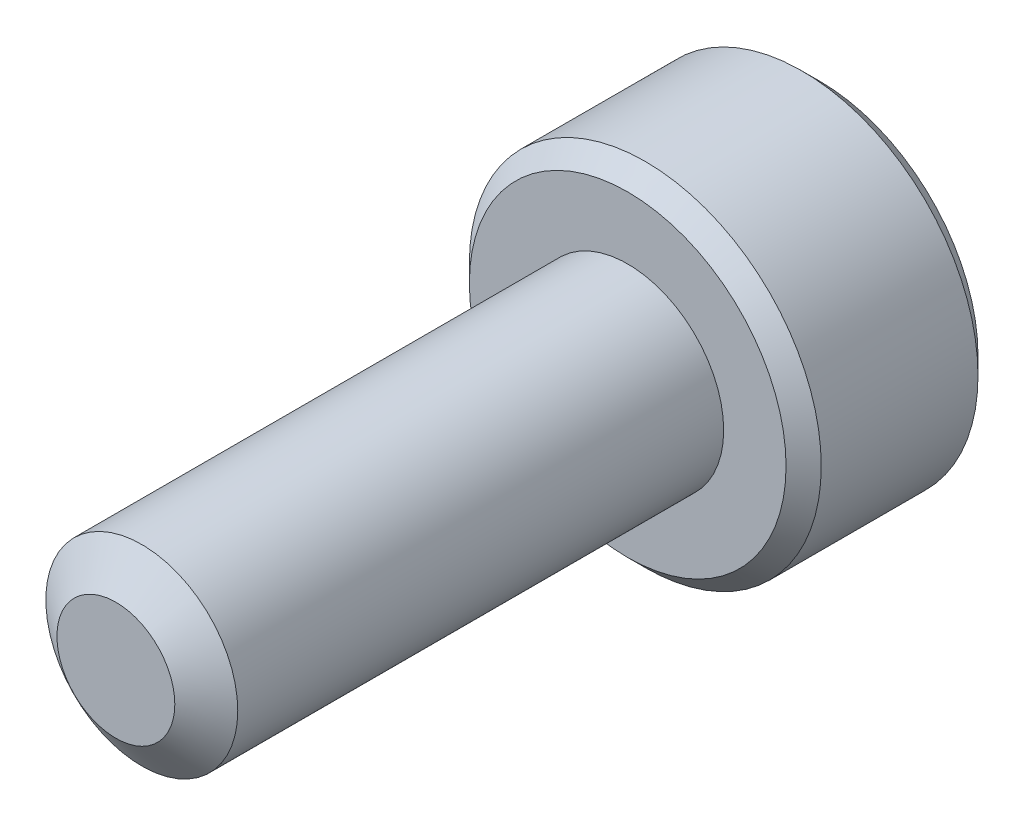
ISO-10303-21;
HEADER;
FILE_DESCRIPTION(('STEP AP214'),'2;1');
FILE_NAME('part.step','',(''),(''),'','','');
FILE_SCHEMA(('AUTOMOTIVE_DESIGN { 1 0 10303 214 1 1 1 1 }'));
ENDSEC;
DATA;
#1=APPLICATION_CONTEXT('core data for automotive mechanical design processes');
#2=APPLICATION_PROTOCOL_DEFINITION('international standard','automotive_design',2000,#1);
#3=PRODUCT_CONTEXT('',#1,'mechanical');
#4=PRODUCT('Part','Part','',(#3));
#5=PRODUCT_RELATED_PRODUCT_CATEGORY('part','',(#4));
#6=PRODUCT_DEFINITION_FORMATION('','',#4);
#7=PRODUCT_DEFINITION_CONTEXT('part definition',#1,'design');
#8=PRODUCT_DEFINITION('design','',#6,#7);
#9=PRODUCT_DEFINITION_SHAPE('','',#8);
#10=(LENGTH_UNIT() NAMED_UNIT(*) SI_UNIT(.MILLI.,.METRE.));
#11=(NAMED_UNIT(*) PLANE_ANGLE_UNIT() SI_UNIT($,.RADIAN.));
#12=(NAMED_UNIT(*) SI_UNIT($,.STERADIAN.) SOLID_ANGLE_UNIT());
#13=UNCERTAINTY_MEASURE_WITH_UNIT(LENGTH_MEASURE(1.E-05),#10,'distance_accuracy_value','');
#14=(GEOMETRIC_REPRESENTATION_CONTEXT(3) GLOBAL_UNCERTAINTY_ASSIGNED_CONTEXT((#13)) GLOBAL_UNIT_ASSIGNED_CONTEXT((#10,
#11,#12)) REPRESENTATION_CONTEXT('',''));
#15=CARTESIAN_POINT('',(0.,0.,0.));
#16=DIRECTION('',(0.,0.,1.));
#17=DIRECTION('',(1.,0.,0.));
#18=AXIS2_PLACEMENT_3D('',#15,#16,#17);
#19=CARTESIAN_POINT('',(0.,0.,-8.));
#20=DIRECTION('',(0.,0.,1.));
#21=DIRECTION('',(1.,0.,0.));
#22=AXIS2_PLACEMENT_3D('',#19,#20,#21);
#23=CYLINDRICAL_SURFACE('',#22,1.5);
#24=CARTESIAN_POINT('',(0.,0.,-8.));
#25=DIRECTION('',(0.,0.,-1.));
#26=DIRECTION('',(-1.,0.,0.));
#27=AXIS2_PLACEMENT_3D('',#24,#25,#26);
#28=CIRCLE('',#27,1.5);
#29=CARTESIAN_POINT('',(-1.5,0.,-8.));
#30=VERTEX_POINT('',#29);
#31=EDGE_CURVE('E154',#30,#30,#28,.F.);
#32=ORIENTED_EDGE('',*,*,#31,.T.);
#33=EDGE_LOOP('',(#32));
#34=FACE_BOUND('',#33,.T.);
#35=CARTESIAN_POINT('',(0.,0.,-0.405251783209379));
#36=DIRECTION('',(0.,0.,1.));
#37=DIRECTION('',(1.,0.,0.));
#38=AXIS2_PLACEMENT_3D('',#35,#36,#37);
#39=CIRCLE('',#38,1.5);
#40=CARTESIAN_POINT('',(1.5,0.,-0.405251783209379));
#41=VERTEX_POINT('',#40);
#42=EDGE_CURVE('E171',#41,#41,#39,.T.);
#43=ORIENTED_EDGE('',*,*,#42,.F.);
#44=EDGE_LOOP('',(#43));
#45=FACE_BOUND('',#44,.T.);
#46=ADVANCED_FACE('F39',(#34,#45),#23,.T.);
#47=CARTESIAN_POINT('',(0.,0.,0.));
#48=DIRECTION('',(0.,0.,-1.));
#49=DIRECTION('',(-1.,0.,0.));
#50=AXIS2_PLACEMENT_3D('',#47,#48,#49);
#51=CONICAL_SURFACE('',#50,0.921240473580835,0.959931088596884);
#52=ORIENTED_EDGE('',*,*,#42,.T.);
#53=EDGE_LOOP('',(#52));
#54=FACE_BOUND('',#53,.T.);
#55=CARTESIAN_POINT('',(0.,0.,0.));
#56=DIRECTION('',(0.,0.,1.));
#57=DIRECTION('',(1.,0.,0.));
#58=AXIS2_PLACEMENT_3D('',#55,#56,#57);
#59=CIRCLE('',#58,0.921240473580835);
#60=CARTESIAN_POINT('',(0.921240473580835,0.,0.));
#61=VERTEX_POINT('',#60);
#62=EDGE_CURVE('E167',#61,#61,#59,.T.);
#63=ORIENTED_EDGE('',*,*,#62,.F.);
#64=EDGE_LOOP('',(#63));
#65=FACE_BOUND('',#64,.T.);
#66=ADVANCED_FACE('F220',(#54,#65),#51,.T.);
#67=CARTESIAN_POINT('',(0.,0.,0.));
#68=DIRECTION('',(0.,0.,1.));
#69=DIRECTION('',(1.,0.,0.));
#70=AXIS2_PLACEMENT_3D('',#67,#68,#69);
#71=PLANE('',#70);
#72=ORIENTED_EDGE('',*,*,#62,.T.);
#73=EDGE_LOOP('',(#72));
#74=FACE_BOUND('',#73,.T.);
#75=ADVANCED_FACE('F226',(#74),#71,.T.);
#76=CARTESIAN_POINT('',(0.,0.,-11.));
#77=DIRECTION('',(0.,0.,1.));
#78=DIRECTION('',(1.,0.,0.));
#79=AXIS2_PLACEMENT_3D('',#76,#77,#78);
#80=CYLINDRICAL_SURFACE('',#79,2.75);
#81=CARTESIAN_POINT('',(0.,0.,-10.725));
#82=DIRECTION('',(0.,0.,-1.));
#83=DIRECTION('',(-1.,0.,0.));
#84=AXIS2_PLACEMENT_3D('',#81,#82,#83);
#85=CIRCLE('',#84,2.75);
#86=CARTESIAN_POINT('',(2.75,0.,-10.725));
#87=VERTEX_POINT('',#86);
#88=EDGE_CURVE('E48',#87,#87,#85,.F.);
#89=ORIENTED_EDGE('',*,*,#88,.T.);
#90=EDGE_LOOP('',(#89));
#91=FACE_BOUND('',#90,.T.);
#92=CARTESIAN_POINT('',(0.,0.,-8.275));
#93=DIRECTION('',(0.,0.,-1.));
#94=DIRECTION('',(-1.,0.,0.));
#95=AXIS2_PLACEMENT_3D('',#92,#93,#94);
#96=CIRCLE('',#95,2.75);
#97=CARTESIAN_POINT('',(-2.75,0.,-8.275));
#98=VERTEX_POINT('',#97);
#99=EDGE_CURVE('E179',#98,#98,#96,.T.);
#100=ORIENTED_EDGE('',*,*,#99,.T.);
#101=EDGE_LOOP('',(#100));
#102=FACE_BOUND('',#101,.T.);
#103=ADVANCED_FACE('F186',(#91,#102),#80,.T.);
#104=CARTESIAN_POINT('',(0.,0.,-11.));
#105=DIRECTION('',(0.,0.,-1.));
#106=DIRECTION('',(-1.,0.,0.));
#107=AXIS2_PLACEMENT_3D('',#104,#105,#106);
#108=PLANE('',#107);
#109=CARTESIAN_POINT('',(0.,0.,-11.));
#110=DIRECTION('',(0.,0.,-1.));
#111=DIRECTION('',(-1.,0.,0.));
#112=AXIS2_PLACEMENT_3D('',#109,#110,#111);
#113=CIRCLE('',#112,2.475);
#114=CARTESIAN_POINT('',(2.475,0.,-11.));
#115=VERTEX_POINT('',#114);
#116=EDGE_CURVE('E175',#115,#115,#113,.T.);
#117=ORIENTED_EDGE('',*,*,#116,.T.);
#118=EDGE_LOOP('',(#117));
#119=FACE_BOUND('',#118,.T.);
#120=DIRECTION('',(0.866025403784439,0.5,0.));
#121=VECTOR('',#120,1.);
#122=CARTESIAN_POINT('',(-1.25,0.721687836487033,-11.));
#123=LINE('',#122,#121);
#124=CARTESIAN_POINT('',(-1.25,0.721687836487033,-11.));
#125=VERTEX_POINT('',#124);
#126=CARTESIAN_POINT('',(0.,1.44337567297406,-11.));
#127=VERTEX_POINT('',#126);
#128=EDGE_CURVE('E55',#125,#127,#123,.T.);
#129=ORIENTED_EDGE('',*,*,#128,.F.);
#130=DIRECTION('',(0.,1.,0.));
#131=VECTOR('',#130,1.);
#132=CARTESIAN_POINT('',(-1.25,-0.721687836487033,-11.));
#133=LINE('',#132,#131);
#134=CARTESIAN_POINT('',(-1.25,-0.721687836487033,-11.));
#135=VERTEX_POINT('',#134);
#136=EDGE_CURVE('E148',#135,#125,#133,.T.);
#137=ORIENTED_EDGE('',*,*,#136,.F.);
#138=DIRECTION('',(-0.866025403784439,0.5,0.));
#139=VECTOR('',#138,1.);
#140=CARTESIAN_POINT('',(0.,-1.44337567297406,-11.));
#141=LINE('',#140,#139);
#142=CARTESIAN_POINT('',(0.,-1.44337567297406,-11.));
#143=VERTEX_POINT('',#142);
#144=EDGE_CURVE('E145',#143,#135,#141,.T.);
#145=ORIENTED_EDGE('',*,*,#144,.F.);
#146=DIRECTION('',(-0.866025403784439,-0.5,0.));
#147=VECTOR('',#146,1.);
#148=CARTESIAN_POINT('',(1.25,-0.721687836487032,-11.));
#149=LINE('',#148,#147);
#150=CARTESIAN_POINT('',(1.25,-0.721687836487032,-11.));
#151=VERTEX_POINT('',#150);
#152=EDGE_CURVE('E103',#151,#143,#149,.T.);
#153=ORIENTED_EDGE('',*,*,#152,.F.);
#154=DIRECTION('',(0.,-1.,0.));
#155=VECTOR('',#154,1.);
#156=CARTESIAN_POINT('',(1.25,0.721687836487033,-11.));
#157=LINE('',#156,#155);
#158=CARTESIAN_POINT('',(1.25,0.721687836487033,-11.));
#159=VERTEX_POINT('',#158);
#160=EDGE_CURVE('E139',#159,#151,#157,.T.);
#161=ORIENTED_EDGE('',*,*,#160,.F.);
#162=DIRECTION('',(0.866025403784439,-0.5,0.));
#163=VECTOR('',#162,1.);
#164=CARTESIAN_POINT('',(0.,1.44337567297406,-11.));
#165=LINE('',#164,#163);
#166=EDGE_CURVE('E135',#127,#159,#165,.T.);
#167=ORIENTED_EDGE('',*,*,#166,.F.);
#168=EDGE_LOOP('',(#129,#137,#145,#153,#161,#167));
#169=FACE_BOUND('',#168,.T.);
#170=ADVANCED_FACE('F194',(#119,#169),#108,.T.);
#171=CARTESIAN_POINT('',(0.,0.,-8.));
#172=DIRECTION('',(0.,0.,-1.));
#173=DIRECTION('',(-1.,0.,0.));
#174=AXIS2_PLACEMENT_3D('',#171,#172,#173);
#175=PLANE('',#174);
#176=CARTESIAN_POINT('',(0.,0.,-8.));
#177=DIRECTION('',(0.,0.,-1.));
#178=DIRECTION('',(-1.,0.,0.));
#179=AXIS2_PLACEMENT_3D('',#176,#177,#178);
#180=CIRCLE('',#179,2.475);
#181=CARTESIAN_POINT('',(-2.475,0.,-8.));
#182=VERTEX_POINT('',#181);
#183=EDGE_CURVE('E11',#182,#182,#180,.F.);
#184=ORIENTED_EDGE('',*,*,#183,.T.);
#185=EDGE_LOOP('',(#184));
#186=FACE_BOUND('',#185,.T.);
#187=ORIENTED_EDGE('',*,*,#31,.F.);
#188=EDGE_LOOP('',(#187));
#189=FACE_BOUND('',#188,.T.);
#190=ADVANCED_FACE('F197',(#186,#189),#175,.F.);
#191=CARTESIAN_POINT('',(-1.25,0.721687836487033,-9.125));
#192=DIRECTION('',(-0.5,0.866025403784439,0.));
#193=DIRECTION('',(-0.866025403784439,-0.5,0.));
#194=AXIS2_PLACEMENT_3D('',#191,#192,#193);
#195=PLANE('',#194);
#196=ORIENTED_EDGE('',*,*,#128,.T.);
#197=DIRECTION('',(0.,0.,-1.));
#198=VECTOR('',#197,1.);
#199=CARTESIAN_POINT('',(0.,1.44337567297406,-9.125));
#200=LINE('',#199,#198);
#201=CARTESIAN_POINT('',(0.,1.44337567297406,-9.125));
#202=VERTEX_POINT('',#201);
#203=EDGE_CURVE('E85',#202,#127,#200,.T.);
#204=ORIENTED_EDGE('',*,*,#203,.F.);
#205=DIRECTION('',(0.866025403784439,0.5,0.));
#206=VECTOR('',#205,1.);
#207=CARTESIAN_POINT('',(-1.25,0.721687836487033,-9.125));
#208=LINE('',#207,#206);
#209=CARTESIAN_POINT('',(-1.25,0.721687836487033,-9.125));
#210=VERTEX_POINT('',#209);
#211=EDGE_CURVE('E151',#210,#202,#208,.T.);
#212=ORIENTED_EDGE('',*,*,#211,.F.);
#213=DIRECTION('',(0.,0.,-1.));
#214=VECTOR('',#213,1.);
#215=CARTESIAN_POINT('',(-1.25,0.721687836487033,-9.125));
#216=LINE('',#215,#214);
#217=EDGE_CURVE('E63',#210,#125,#216,.T.);
#218=ORIENTED_EDGE('',*,*,#217,.T.);
#219=EDGE_LOOP('',(#196,#204,#212,#218));
#220=FACE_BOUND('',#219,.T.);
#221=ADVANCED_FACE('F207',(#220),#195,.F.);
#222=CARTESIAN_POINT('',(-1.25,-0.721687836487033,-9.125));
#223=DIRECTION('',(-1.,0.,0.));
#224=DIRECTION('',(0.,-1.,0.));
#225=AXIS2_PLACEMENT_3D('',#222,#223,#224);
#226=PLANE('',#225);
#227=ORIENTED_EDGE('',*,*,#136,.T.);
#228=ORIENTED_EDGE('',*,*,#217,.F.);
#229=DIRECTION('',(0.,1.,0.));
#230=VECTOR('',#229,1.);
#231=CARTESIAN_POINT('',(-1.25,-0.721687836487033,-9.125));
#232=LINE('',#231,#230);
#233=CARTESIAN_POINT('',(-1.25,-0.721687836487033,-9.125));
#234=VERTEX_POINT('',#233);
#235=EDGE_CURVE('E117',#234,#210,#232,.T.);
#236=ORIENTED_EDGE('',*,*,#235,.F.);
#237=DIRECTION('',(0.,0.,-1.));
#238=VECTOR('',#237,1.);
#239=CARTESIAN_POINT('',(-1.25,-0.721687836487033,-9.125));
#240=LINE('',#239,#238);
#241=EDGE_CURVE('E108',#234,#135,#240,.T.);
#242=ORIENTED_EDGE('',*,*,#241,.T.);
#243=EDGE_LOOP('',(#227,#228,#236,#242));
#244=FACE_BOUND('',#243,.T.);
#245=ADVANCED_FACE('F209',(#244),#226,.F.);
#246=CARTESIAN_POINT('',(0.,-1.44337567297406,-9.125));
#247=DIRECTION('',(-0.5,-0.866025403784439,0.));
#248=DIRECTION('',(0.866025403784439,-0.5,0.));
#249=AXIS2_PLACEMENT_3D('',#246,#247,#248);
#250=PLANE('',#249);
#251=ORIENTED_EDGE('',*,*,#144,.T.);
#252=ORIENTED_EDGE('',*,*,#241,.F.);
#253=DIRECTION('',(-0.866025403784439,0.5,0.));
#254=VECTOR('',#253,1.);
#255=CARTESIAN_POINT('',(0.,-1.44337567297406,-9.125));
#256=LINE('',#255,#254);
#257=CARTESIAN_POINT('',(0.,-1.44337567297406,-9.125));
#258=VERTEX_POINT('',#257);
#259=EDGE_CURVE('E112',#258,#234,#256,.T.);
#260=ORIENTED_EDGE('',*,*,#259,.F.);
#261=DIRECTION('',(0.,0.,-1.));
#262=VECTOR('',#261,1.);
#263=CARTESIAN_POINT('',(0.,-1.44337567297406,-9.125));
#264=LINE('',#263,#262);
#265=EDGE_CURVE('E96',#258,#143,#264,.T.);
#266=ORIENTED_EDGE('',*,*,#265,.T.);
#267=EDGE_LOOP('',(#251,#252,#260,#266));
#268=FACE_BOUND('',#267,.T.);
#269=ADVANCED_FACE('F113',(#268),#250,.F.);
#270=CARTESIAN_POINT('',(1.25,-0.721687836487032,-9.125));
#271=DIRECTION('',(0.5,-0.866025403784439,0.));
#272=DIRECTION('',(0.866025403784439,0.5,0.));
#273=AXIS2_PLACEMENT_3D('',#270,#271,#272);
#274=PLANE('',#273);
#275=ORIENTED_EDGE('',*,*,#152,.T.);
#276=ORIENTED_EDGE('',*,*,#265,.F.);
#277=DIRECTION('',(-0.866025403784439,-0.5,0.));
#278=VECTOR('',#277,1.);
#279=CARTESIAN_POINT('',(1.25,-0.721687836487032,-9.125));
#280=LINE('',#279,#278);
#281=CARTESIAN_POINT('',(1.25,-0.721687836487032,-9.125));
#282=VERTEX_POINT('',#281);
#283=EDGE_CURVE('E100',#282,#258,#280,.T.);
#284=ORIENTED_EDGE('',*,*,#283,.F.);
#285=DIRECTION('',(0.,0.,-1.));
#286=VECTOR('',#285,1.);
#287=CARTESIAN_POINT('',(1.25,-0.721687836487032,-9.125));
#288=LINE('',#287,#286);
#289=EDGE_CURVE('E109',#282,#151,#288,.T.);
#290=ORIENTED_EDGE('',*,*,#289,.T.);
#291=EDGE_LOOP('',(#275,#276,#284,#290));
#292=FACE_BOUND('',#291,.T.);
#293=ADVANCED_FACE('F98',(#292),#274,.F.);
#294=CARTESIAN_POINT('',(1.25,0.721687836487033,-9.125));
#295=DIRECTION('',(1.,0.,0.));
#296=DIRECTION('',(0.,0.,-1.));
#297=AXIS2_PLACEMENT_3D('',#294,#295,#296);
#298=PLANE('',#297);
#299=ORIENTED_EDGE('',*,*,#160,.T.);
#300=ORIENTED_EDGE('',*,*,#289,.F.);
#301=DIRECTION('',(0.,-1.,0.));
#302=VECTOR('',#301,1.);
#303=CARTESIAN_POINT('',(1.25,0.721687836487033,-9.125));
#304=LINE('',#303,#302);
#305=CARTESIAN_POINT('',(1.25,0.721687836487033,-9.125));
#306=VERTEX_POINT('',#305);
#307=EDGE_CURVE('E123',#306,#282,#304,.T.);
#308=ORIENTED_EDGE('',*,*,#307,.F.);
#309=DIRECTION('',(0.,0.,-1.));
#310=VECTOR('',#309,1.);
#311=CARTESIAN_POINT('',(1.25,0.721687836487033,-9.125));
#312=LINE('',#311,#310);
#313=EDGE_CURVE('E159',#306,#159,#312,.T.);
#314=ORIENTED_EDGE('',*,*,#313,.T.);
#315=EDGE_LOOP('',(#299,#300,#308,#314));
#316=FACE_BOUND('',#315,.T.);
#317=ADVANCED_FACE('F281',(#316),#298,.F.);
#318=CARTESIAN_POINT('',(0.,1.44337567297406,-9.125));
#319=DIRECTION('',(0.5,0.866025403784439,0.));
#320=DIRECTION('',(-0.866025403784439,0.5,0.));
#321=AXIS2_PLACEMENT_3D('',#318,#319,#320);
#322=PLANE('',#321);
#323=ORIENTED_EDGE('',*,*,#166,.T.);
#324=ORIENTED_EDGE('',*,*,#313,.F.);
#325=DIRECTION('',(0.866025403784439,-0.5,0.));
#326=VECTOR('',#325,1.);
#327=CARTESIAN_POINT('',(0.,1.44337567297406,-9.125));
#328=LINE('',#327,#326);
#329=EDGE_CURVE('E127',#202,#306,#328,.T.);
#330=ORIENTED_EDGE('',*,*,#329,.F.);
#331=ORIENTED_EDGE('',*,*,#203,.T.);
#332=EDGE_LOOP('',(#323,#324,#330,#331));
#333=FACE_BOUND('',#332,.T.);
#334=ADVANCED_FACE('F203',(#333),#322,.F.);
#335=CARTESIAN_POINT('',(1.25,2.1650635094611,-9.125));
#336=DIRECTION('',(0.,0.,-1.));
#337=DIRECTION('',(-1.,0.,0.));
#338=AXIS2_PLACEMENT_3D('',#335,#336,#337);
#339=PLANE('',#338);
#340=ORIENTED_EDGE('',*,*,#211,.T.);
#341=ORIENTED_EDGE('',*,*,#329,.T.);
#342=ORIENTED_EDGE('',*,*,#307,.T.);
#343=ORIENTED_EDGE('',*,*,#283,.T.);
#344=ORIENTED_EDGE('',*,*,#259,.T.);
#345=ORIENTED_EDGE('',*,*,#235,.T.);
#346=EDGE_LOOP('',(#340,#341,#342,#343,#344,#345));
#347=FACE_BOUND('',#346,.T.);
#348=ADVANCED_FACE('F120',(#347),#339,.T.);
#349=CARTESIAN_POINT('',(0.,0.,-11.));
#350=DIRECTION('',(0.,0.,1.));
#351=DIRECTION('',(1.,0.,0.));
#352=AXIS2_PLACEMENT_3D('',#349,#350,#351);
#353=CONICAL_SURFACE('',#352,2.475,0.785398163397447);
#354=CARTESIAN_POINT('',(2.75,0.,-10.725));
#355=CARTESIAN_POINT('',(2.74713541666667,0.,-10.7278645833333));
#356=CARTESIAN_POINT('',(2.74427083333333,0.,-10.7307291666667));
#357=CARTESIAN_POINT('',(2.73854166666667,0.,-10.7364583333333));
#358=CARTESIAN_POINT('',(2.73567708333333,0.,-10.7393229166667));
#359=CARTESIAN_POINT('',(2.72994791666667,0.,-10.7450520833333));
#360=CARTESIAN_POINT('',(2.72708333333333,0.,-10.7479166666667));
#361=CARTESIAN_POINT('',(2.72135416666667,0.,-10.7536458333333));
#362=CARTESIAN_POINT('',(2.71848958333333,0.,-10.7565104166667));
#363=CARTESIAN_POINT('',(2.71276041666667,0.,-10.7622395833333));
#364=CARTESIAN_POINT('',(2.70989583333333,0.,-10.7651041666667));
#365=CARTESIAN_POINT('',(2.70416666666667,0.,-10.7708333333333));
#366=CARTESIAN_POINT('',(2.70130208333333,0.,-10.7736979166667));
#367=CARTESIAN_POINT('',(2.69557291666667,0.,-10.7794270833333));
#368=CARTESIAN_POINT('',(2.69270833333333,0.,-10.7822916666667));
#369=CARTESIAN_POINT('',(2.68697916666667,0.,-10.7880208333333));
#370=CARTESIAN_POINT('',(2.68411458333333,0.,-10.7908854166667));
#371=CARTESIAN_POINT('',(2.67838541666667,0.,-10.7966145833333));
#372=CARTESIAN_POINT('',(2.67552083333333,0.,-10.7994791666667));
#373=CARTESIAN_POINT('',(2.66979166666667,0.,-10.8052083333333));
#374=CARTESIAN_POINT('',(2.66692708333333,0.,-10.8080729166667));
#375=CARTESIAN_POINT('',(2.66119791666667,0.,-10.8138020833333));
#376=CARTESIAN_POINT('',(2.65833333333333,0.,-10.8166666666667));
#377=CARTESIAN_POINT('',(2.65260416666667,0.,-10.8223958333333));
#378=CARTESIAN_POINT('',(2.64973958333333,0.,-10.8252604166667));
#379=CARTESIAN_POINT('',(2.64401041666667,0.,-10.8309895833333));
#380=CARTESIAN_POINT('',(2.64114583333333,0.,-10.8338541666667));
#381=CARTESIAN_POINT('',(2.63541666666667,0.,-10.8395833333333));
#382=CARTESIAN_POINT('',(2.63255208333333,0.,-10.8424479166667));
#383=CARTESIAN_POINT('',(2.62682291666667,0.,-10.8481770833333));
#384=CARTESIAN_POINT('',(2.62395833333333,0.,-10.8510416666667));
#385=CARTESIAN_POINT('',(2.61822916666667,0.,-10.8567708333333));
#386=CARTESIAN_POINT('',(2.61536458333333,0.,-10.8596354166667));
#387=CARTESIAN_POINT('',(2.60963541666667,0.,-10.8653645833333));
#388=CARTESIAN_POINT('',(2.60677083333333,0.,-10.8682291666667));
#389=CARTESIAN_POINT('',(2.60104166666667,0.,-10.8739583333333));
#390=CARTESIAN_POINT('',(2.59817708333333,0.,-10.8768229166667));
#391=CARTESIAN_POINT('',(2.59244791666667,0.,-10.8825520833333));
#392=CARTESIAN_POINT('',(2.58958333333333,0.,-10.8854166666667));
#393=CARTESIAN_POINT('',(2.58385416666667,0.,-10.8911458333333));
#394=CARTESIAN_POINT('',(2.58098958333333,0.,-10.8940104166667));
#395=CARTESIAN_POINT('',(2.57526041666667,0.,-10.8997395833333));
#396=CARTESIAN_POINT('',(2.57239583333333,0.,-10.9026041666667));
#397=CARTESIAN_POINT('',(2.56666666666667,0.,-10.9083333333333));
#398=CARTESIAN_POINT('',(2.56380208333333,0.,-10.9111979166667));
#399=CARTESIAN_POINT('',(2.55807291666667,0.,-10.9169270833333));
#400=CARTESIAN_POINT('',(2.55520833333333,0.,-10.9197916666667));
#401=CARTESIAN_POINT('',(2.54947916666667,0.,-10.9255208333333));
#402=CARTESIAN_POINT('',(2.54661458333333,0.,-10.9283854166667));
#403=CARTESIAN_POINT('',(2.54088541666667,0.,-10.9341145833333));
#404=CARTESIAN_POINT('',(2.53802083333333,0.,-10.9369791666667));
#405=CARTESIAN_POINT('',(2.53229166666667,0.,-10.9427083333333));
#406=CARTESIAN_POINT('',(2.52942708333333,0.,-10.9455729166667));
#407=CARTESIAN_POINT('',(2.52369791666667,0.,-10.9513020833333));
#408=CARTESIAN_POINT('',(2.52083333333333,0.,-10.9541666666667));
#409=CARTESIAN_POINT('',(2.51510416666667,0.,-10.9598958333333));
#410=CARTESIAN_POINT('',(2.51223958333333,0.,-10.9627604166667));
#411=CARTESIAN_POINT('',(2.50651041666667,0.,-10.9684895833333));
#412=CARTESIAN_POINT('',(2.50364583333333,0.,-10.9713541666667));
#413=CARTESIAN_POINT('',(2.49791666666667,0.,-10.9770833333333));
#414=CARTESIAN_POINT('',(2.49505208333333,0.,-10.9799479166667));
#415=CARTESIAN_POINT('',(2.48932291666667,0.,-10.9856770833333));
#416=CARTESIAN_POINT('',(2.48645833333333,0.,-10.9885416666667));
#417=CARTESIAN_POINT('',(2.48072916666667,0.,-10.9942708333333));
#418=CARTESIAN_POINT('',(2.47786458333333,0.,-10.9971354166667));
#419=CARTESIAN_POINT('',(2.475,0.,-11.));
#420=B_SPLINE_CURVE_WITH_KNOTS('',3,(#354,#355,#356,#357,#358,#359,#360,#361,#362,#363,#364,
#365,#366,#367,#368,#369,#370,#371,#372,#373,#374,#375,#376,#377,#378,#379,#380,#381,#382,#383,
#384,#385,#386,#387,#388,#389,#390,#391,#392,#393,#394,#395,#396,#397,#398,#399,#400,#401,#402,
#403,#404,#405,#406,#407,#408,#409,#410,#411,#412,#413,#414,#415,#416,#417,#418,#419),
.UNSPECIFIED.,.F.,.F.,(4,2,2,2,2,2,2,2,2,2,2,2,2,2,2,2,2,2,2,2,2,2,2,2,2,2,2,2,2,2,2,2,4),(0.,
0.0121533978016443,0.0243067956032886,0.0364601934049316,0.0486135912065759,0.0607669890082193,
0.0729203868098636,0.0850737846115066,0.0972271824131509,0.109380580214796,0.121533978016439,
0.133687375818083,0.145840773619726,0.15799417142137,0.170147569223013,0.182300967024658,
0.194454364826301,0.206607762627945,0.21876116042959,0.230914558231233,0.243067956032877,
0.25522135383452,0.267374751636165,0.279528149437808,0.291681547239452,0.303834945041096,
0.31598834284274,0.328141740644384,0.340295138446027,0.352448536247671,0.364601934049314,
0.376755331850959,0.388908729652603),.UNSPECIFIED.);
#421=EDGE_CURVE('BSEAM189',#87,#115,#420,.T.);
#422=ORIENTED_EDGE('',*,*,#88,.F.);
#423=ORIENTED_EDGE('',*,*,#116,.F.);
#424=ORIENTED_EDGE('',*,*,#421,.T.);
#425=ORIENTED_EDGE('',*,*,#421,.F.);
#426=EDGE_LOOP('',(#422,#424,#423,#425));
#427=FACE_BOUND('',#426,.T.);
#428=ADVANCED_FACE('F189',(#427),#353,.T.);
#429=CARTESIAN_POINT('',(0.,0.,-8.275));
#430=DIRECTION('',(0.,0.,-1.));
#431=DIRECTION('',(-1.,0.,0.));
#432=AXIS2_PLACEMENT_3D('',#429,#430,#431);
#433=CONICAL_SURFACE('',#432,2.75,0.785398163397453);
#434=ORIENTED_EDGE('',*,*,#183,.F.);
#435=EDGE_LOOP('',(#434));
#436=FACE_BOUND('',#435,.T.);
#437=ORIENTED_EDGE('',*,*,#99,.F.);
#438=EDGE_LOOP('',(#437));
#439=FACE_BOUND('',#438,.T.);
#440=ADVANCED_FACE('F41',(#436,#439),#433,.T.);
#441=CLOSED_SHELL('',(#46,#66,#75,#103,#170,#190,#221,#245,#269,#293,#317,#334,#348,#428,#440));
#442=MANIFOLD_SOLID_BREP('B2',#441);
#443=ADVANCED_BREP_SHAPE_REPRESENTATION('',(#18,#442),#14);
#444=SHAPE_DEFINITION_REPRESENTATION(#9,#443);
ENDSEC;
END-ISO-10303-21;
